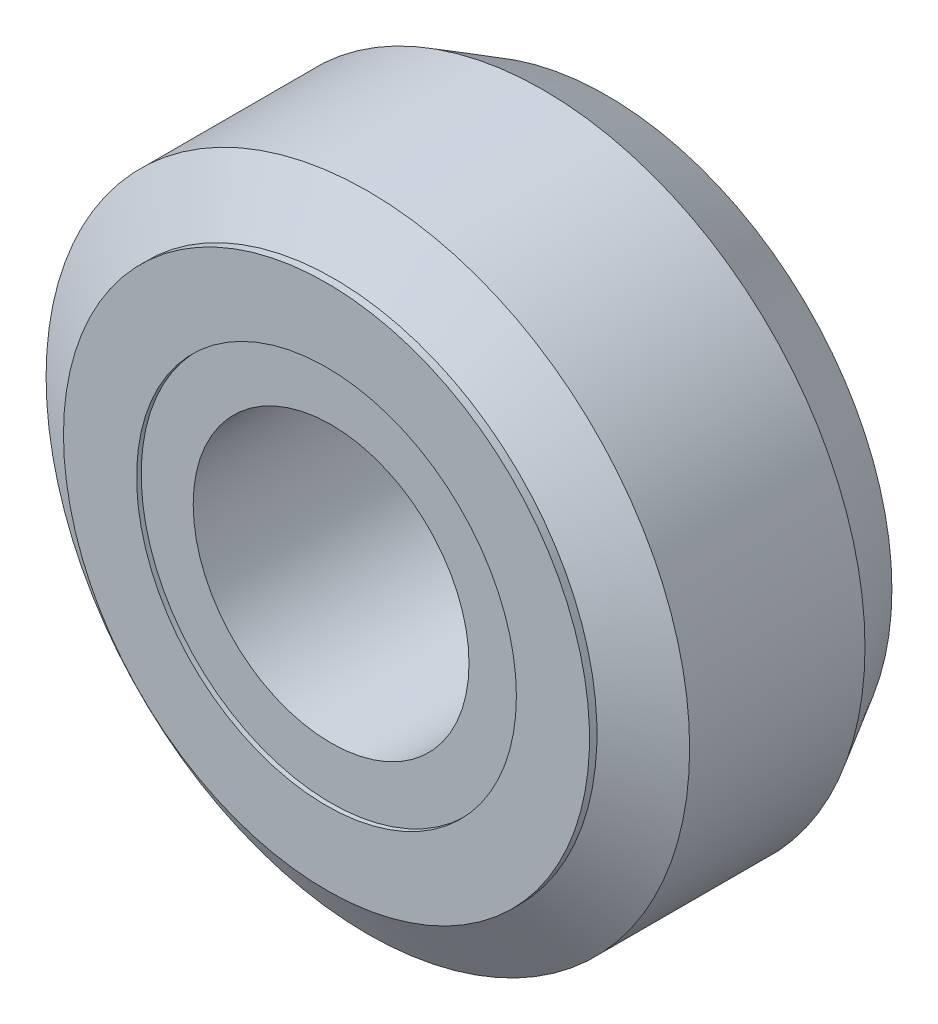
ISO-10303-21;
HEADER;
FILE_DESCRIPTION(('STEP AP214'),'2;1');
FILE_NAME('part.step','',(''),(''),'','','');
FILE_SCHEMA(('AUTOMOTIVE_DESIGN { 1 0 10303 214 1 1 1 1 }'));
ENDSEC;
DATA;
#1=APPLICATION_CONTEXT('core data for automotive mechanical design processes');
#2=APPLICATION_PROTOCOL_DEFINITION('international standard','automotive_design',2000,#1);
#3=PRODUCT_CONTEXT('',#1,'mechanical');
#4=PRODUCT('Part','Part','',(#3));
#5=PRODUCT_RELATED_PRODUCT_CATEGORY('part','',(#4));
#6=PRODUCT_DEFINITION_FORMATION('','',#4);
#7=PRODUCT_DEFINITION_CONTEXT('part definition',#1,'design');
#8=PRODUCT_DEFINITION('design','',#6,#7);
#9=PRODUCT_DEFINITION_SHAPE('','',#8);
#10=(LENGTH_UNIT() NAMED_UNIT(*) SI_UNIT(.MILLI.,.METRE.));
#11=(NAMED_UNIT(*) PLANE_ANGLE_UNIT() SI_UNIT($,.RADIAN.));
#12=(NAMED_UNIT(*) SI_UNIT($,.STERADIAN.) SOLID_ANGLE_UNIT());
#13=UNCERTAINTY_MEASURE_WITH_UNIT(LENGTH_MEASURE(1.E-05),#10,'distance_accuracy_value','');
#14=(GEOMETRIC_REPRESENTATION_CONTEXT(3) GLOBAL_UNCERTAINTY_ASSIGNED_CONTEXT((#13)) GLOBAL_UNIT_ASSIGNED_CONTEXT((#10,
#11,#12)) REPRESENTATION_CONTEXT('',''));
#15=CARTESIAN_POINT('',(0.,0.,0.));
#16=DIRECTION('',(0.,0.,1.));
#17=DIRECTION('',(1.,0.,0.));
#18=AXIS2_PLACEMENT_3D('',#15,#16,#17);
#19=CARTESIAN_POINT('',(0.,0.,1.5));
#20=DIRECTION('',(0.,0.,-1.));
#21=DIRECTION('',(-1.,0.,0.));
#22=AXIS2_PLACEMENT_3D('',#19,#20,#21);
#23=CONICAL_SURFACE('',#22,2.80717967697245,1.0471975511966);
#24=CARTESIAN_POINT('',(0.,0.,1.1));
#25=DIRECTION('',(0.,0.,1.));
#26=DIRECTION('',(1.,0.,0.));
#27=AXIS2_PLACEMENT_3D('',#24,#25,#26);
#28=CIRCLE('',#27,3.5);
#29=CARTESIAN_POINT('',(-3.5,0.,1.1));
#30=VERTEX_POINT('',#29);
#31=EDGE_CURVE('E53',#30,#30,#28,.F.);
#32=CARTESIAN_POINT('',(0.,0.,1.46896578970993));
#33=DIRECTION('',(0.,0.,-1.));
#34=DIRECTION('',(-1.,0.,0.));
#35=AXIS2_PLACEMENT_3D('',#32,#33,#34);
#36=CIRCLE('',#35,2.86093250596764);
#37=CARTESIAN_POINT('',(-2.86093250596764,0.,1.46896578970993));
#38=VERTEX_POINT('',#37);
#39=EDGE_CURVE('E63',#38,#38,#36,.T.);
#40=CARTESIAN_POINT('',(-3.5,0.,1.1));
#41=CARTESIAN_POINT('',(-3.49334304693716,0.,1.10384339364281));
#42=CARTESIAN_POINT('',(-3.48668609387433,0.,1.10768678728562));
#43=CARTESIAN_POINT('',(-3.47337218774865,0.,1.11537357457125));
#44=CARTESIAN_POINT('',(-3.46671523468581,0.,1.11921696821406));
#45=CARTESIAN_POINT('',(-3.45340132856014,0.,1.12690375549968));
#46=CARTESIAN_POINT('',(-3.4467443754973,0.,1.13074714914249));
#47=CARTESIAN_POINT('',(-3.43343046937163,0.,1.13843393642812));
#48=CARTESIAN_POINT('',(-3.42677351630879,0.,1.14227733007093));
#49=CARTESIAN_POINT('',(-3.41345961018312,0.,1.14996411735655));
#50=CARTESIAN_POINT('',(-3.40680265712028,0.,1.15380751099936));
#51=CARTESIAN_POINT('',(-3.39348875099461,0.,1.16149429828499));
#52=CARTESIAN_POINT('',(-3.38683179793177,0.,1.1653376919278));
#53=CARTESIAN_POINT('',(-3.37351789180609,0.,1.17302447921342));
#54=CARTESIAN_POINT('',(-3.36686093874326,0.,1.17686787285623));
#55=CARTESIAN_POINT('',(-3.35354703261758,0.,1.18455466014186));
#56=CARTESIAN_POINT('',(-3.34689007955475,0.,1.18839805378467));
#57=CARTESIAN_POINT('',(-3.33357617342907,0.,1.19608484107029));
#58=CARTESIAN_POINT('',(-3.32691922036624,0.,1.19992823471311));
#59=CARTESIAN_POINT('',(-3.31360531424056,0.,1.20761502199873));
#60=CARTESIAN_POINT('',(-3.30694836117772,0.,1.21145841564154));
#61=CARTESIAN_POINT('',(-3.29363445505205,0.,1.21914520292716));
#62=CARTESIAN_POINT('',(-3.28697750198921,0.,1.22298859656998));
#63=CARTESIAN_POINT('',(-3.27366359586354,0.,1.2306753838556));
#64=CARTESIAN_POINT('',(-3.2670066428007,0.,1.23451877749841));
#65=CARTESIAN_POINT('',(-3.25369273667503,0.,1.24220556478403));
#66=CARTESIAN_POINT('',(-3.24703578361219,0.,1.24604895842685));
#67=CARTESIAN_POINT('',(-3.23372187748652,0.,1.25373574571247));
#68=CARTESIAN_POINT('',(-3.22706492442368,0.,1.25757913935528));
#69=CARTESIAN_POINT('',(-3.213751018298,0.,1.2652659266409));
#70=CARTESIAN_POINT('',(-3.20709406523517,0.,1.26910932028372));
#71=CARTESIAN_POINT('',(-3.19378015910949,0.,1.27679610756934));
#72=CARTESIAN_POINT('',(-3.18712320604666,0.,1.28063950121215));
#73=CARTESIAN_POINT('',(-3.17380929992098,0.,1.28832628849777));
#74=CARTESIAN_POINT('',(-3.16715234685814,0.,1.29216968214059));
#75=CARTESIAN_POINT('',(-3.15383844073247,0.,1.29985646942621));
#76=CARTESIAN_POINT('',(-3.14718148766963,0.,1.30369986306902));
#77=CARTESIAN_POINT('',(-3.13386758154396,0.,1.31138665035465));
#78=CARTESIAN_POINT('',(-3.12721062848112,0.,1.31523004399746));
#79=CARTESIAN_POINT('',(-3.11389672235545,0.,1.32291683128308));
#80=CARTESIAN_POINT('',(-3.10723976929261,0.,1.32676022492589));
#81=CARTESIAN_POINT('',(-3.09392586316694,0.,1.33444701221152));
#82=CARTESIAN_POINT('',(-3.0872689101041,0.,1.33829040585433));
#83=CARTESIAN_POINT('',(-3.07395500397842,0.,1.34597719313995));
#84=CARTESIAN_POINT('',(-3.06729805091559,0.,1.34982058678276));
#85=CARTESIAN_POINT('',(-3.05398414478991,0.,1.35750737406839));
#86=CARTESIAN_POINT('',(-3.04732719172708,0.,1.3613507677112));
#87=CARTESIAN_POINT('',(-3.0340132856014,0.,1.36903755499682));
#88=CARTESIAN_POINT('',(-3.02735633253856,0.,1.37288094863963));
#89=CARTESIAN_POINT('',(-3.01404242641289,0.,1.38056773592526));
#90=CARTESIAN_POINT('',(-3.00738547335005,0.,1.38441112956807));
#91=CARTESIAN_POINT('',(-2.99407156722438,0.,1.39209791685369));
#92=CARTESIAN_POINT('',(-2.98741461416154,0.,1.3959413104965));
#93=CARTESIAN_POINT('',(-2.97410070803587,0.,1.40362809778213));
#94=CARTESIAN_POINT('',(-2.96744375497303,0.,1.40747149142494));
#95=CARTESIAN_POINT('',(-2.95412984884736,0.,1.41515827871056));
#96=CARTESIAN_POINT('',(-2.94747289578452,0.,1.41900167235337));
#97=CARTESIAN_POINT('',(-2.93415898965884,0.,1.426688459639));
#98=CARTESIAN_POINT('',(-2.92750203659601,0.,1.43053185328181));
#99=CARTESIAN_POINT('',(-2.91418813047033,0.,1.43821864056743));
#100=CARTESIAN_POINT('',(-2.9075311774075,0.,1.44206203421024));
#101=CARTESIAN_POINT('',(-2.89421727128182,0.,1.44974882149587));
#102=CARTESIAN_POINT('',(-2.88756031821899,0.,1.45359221513868));
#103=CARTESIAN_POINT('',(-2.87424641209331,0.,1.4612790024243));
#104=CARTESIAN_POINT('',(-2.86758945903047,0.,1.46512239606711));
#105=CARTESIAN_POINT('',(-2.86093250596764,0.,1.46896578970993));
#106=B_SPLINE_CURVE_WITH_KNOTS('',3,(#40,#41,#42,#43,#44,#45,#46,#47,#48,#49,#50,#51,#52,#53,
#54,#55,#56,#57,#58,#59,#60,#61,#62,#63,#64,#65,#66,#67,#68,#69,#70,#71,#72,#73,#74,#75,#76,#77,
#78,#79,#80,#81,#82,#83,#84,#85,#86,#87,#88,#89,#90,#91,#92,#93,#94,#95,#96,#97,#98,#99,#100,
#101,#102,#103,#104,#105),.UNSPECIFIED.,.F.,.F.,(4,2,2,2,2,2,2,2,2,2,2,2,2,2,2,2,2,2,2,2,2,2,2,
2,2,2,2,2,2,2,2,2,4),(0.,0.0230603618568704,0.0461207237137406,0.0691810855706109,
0.0922414474274813,0.115301809284352,0.138362171141222,0.161422532998092,0.184482894854962,
0.207543256711833,0.230603618568703,0.253663980425573,0.276724342282444,0.299784704139314,
0.322845065996184,0.345905427853055,0.368965789709925,0.392026151566795,0.415086513423665,
0.438146875280536,0.461207237137406,0.484267598994277,0.507327960851147,0.530388322708017,
0.553448684564887,0.576509046421758,0.599569408278628,0.622629770135498,0.645690131992368,
0.668750493849239,0.691810855706109,0.714871217562979,0.73793157941985),.UNSPECIFIED.);
#107=EDGE_CURVE('BSEAM33',#30,#38,#106,.T.);
#108=ORIENTED_EDGE('',*,*,#31,.F.);
#109=ORIENTED_EDGE('',*,*,#39,.T.);
#110=ORIENTED_EDGE('',*,*,#107,.T.);
#111=ORIENTED_EDGE('',*,*,#107,.F.);
#112=EDGE_LOOP('',(#108,#110,#109,#111));
#113=FACE_BOUND('',#112,.T.);
#114=ADVANCED_FACE('F33',(#113),#23,.T.);
#115=CARTESIAN_POINT('',(0.,0.,-1.5));
#116=DIRECTION('',(0.,0.,1.));
#117=DIRECTION('',(1.,0.,0.));
#118=AXIS2_PLACEMENT_3D('',#115,#116,#117);
#119=PLANE('',#118);
#120=CARTESIAN_POINT('',(0.,0.,-1.5));
#121=DIRECTION('',(0.,0.,1.));
#122=DIRECTION('',(1.,0.,0.));
#123=AXIS2_PLACEMENT_3D('',#120,#121,#122);
#124=CIRCLE('',#123,2.86093250596764);
#125=CARTESIAN_POINT('',(2.86093250596764,0.,-1.5));
#126=VERTEX_POINT('',#125);
#127=EDGE_CURVE('E41',#126,#126,#124,.F.);
#128=ORIENTED_EDGE('',*,*,#127,.F.);
#129=EDGE_LOOP('',(#128));
#130=FACE_BOUND('',#129,.T.);
#131=CARTESIAN_POINT('',(0.,0.,-1.5));
#132=DIRECTION('',(0.,0.,1.));
#133=DIRECTION('',(1.,0.,0.));
#134=AXIS2_PLACEMENT_3D('',#131,#132,#133);
#135=CIRCLE('',#134,3.1);
#136=CARTESIAN_POINT('',(3.1,0.,-1.5));
#137=VERTEX_POINT('',#136);
#138=EDGE_CURVE('E46',#137,#137,#135,.F.);
#139=ORIENTED_EDGE('',*,*,#138,.T.);
#140=EDGE_LOOP('',(#139));
#141=FACE_BOUND('',#140,.T.);
#142=ADVANCED_FACE('F99',(#130,#141),#119,.F.);
#143=CARTESIAN_POINT('',(0.,0.,1.5));
#144=DIRECTION('',(0.,0.,-1.));
#145=DIRECTION('',(-1.,0.,0.));
#146=AXIS2_PLACEMENT_3D('',#143,#144,#145);
#147=CYLINDRICAL_SURFACE('',#146,3.5);
#148=CARTESIAN_POINT('',(0.,0.,-0.807179676972451));
#149=DIRECTION('',(0.,0.,1.));
#150=DIRECTION('',(1.,0.,0.));
#151=AXIS2_PLACEMENT_3D('',#148,#149,#150);
#152=CIRCLE('',#151,3.5);
#153=CARTESIAN_POINT('',(3.5,0.,-0.807179676972451));
#154=VERTEX_POINT('',#153);
#155=EDGE_CURVE('E59',#154,#154,#152,.T.);
#156=ORIENTED_EDGE('',*,*,#155,.T.);
#157=EDGE_LOOP('',(#156));
#158=FACE_BOUND('',#157,.T.);
#159=ORIENTED_EDGE('',*,*,#31,.T.);
#160=EDGE_LOOP('',(#159));
#161=FACE_BOUND('',#160,.T.);
#162=ADVANCED_FACE('F104',(#158,#161),#147,.T.);
#163=CARTESIAN_POINT('',(0.,0.,-0.807179676972451));
#164=DIRECTION('',(0.,0.,1.));
#165=DIRECTION('',(1.,0.,0.));
#166=AXIS2_PLACEMENT_3D('',#163,#164,#165);
#167=CONICAL_SURFACE('',#166,3.5,0.523598775598299);
#168=ORIENTED_EDGE('',*,*,#138,.F.);
#169=EDGE_LOOP('',(#168));
#170=FACE_BOUND('',#169,.T.);
#171=ORIENTED_EDGE('',*,*,#155,.F.);
#172=EDGE_LOOP('',(#171));
#173=FACE_BOUND('',#172,.T.);
#174=ADVANCED_FACE('F111',(#170,#173),#167,.T.);
#175=CARTESIAN_POINT('',(0.,0.,-1.55));
#176=DIRECTION('',(0.,0.,1.));
#177=DIRECTION('',(1.,0.,0.));
#178=AXIS2_PLACEMENT_3D('',#175,#176,#177);
#179=CYLINDRICAL_SURFACE('',#178,2.06554146878285);
#180=CARTESIAN_POINT('',(0.,0.,1.5));
#181=DIRECTION('',(0.,0.,1.));
#182=DIRECTION('',(1.,0.,0.));
#183=AXIS2_PLACEMENT_3D('',#180,#181,#182);
#184=CIRCLE('',#183,2.06554146878285);
#185=CARTESIAN_POINT('',(2.06554146878285,0.,1.5));
#186=VERTEX_POINT('',#185);
#187=EDGE_CURVE('E10',#186,#186,#184,.F.);
#188=CARTESIAN_POINT('',(0.,0.,1.55));
#189=DIRECTION('',(0.,0.,-1.));
#190=DIRECTION('',(-1.,0.,0.));
#191=AXIS2_PLACEMENT_3D('',#188,#189,#190);
#192=CIRCLE('',#191,2.06554146878285);
#193=CARTESIAN_POINT('',(2.06554146878285,0.,1.55));
#194=VERTEX_POINT('',#193);
#195=EDGE_CURVE('E77',#194,#194,#192,.T.);
#196=CARTESIAN_POINT('',(2.06554146878285,0.,1.5));
#197=CARTESIAN_POINT('',(2.06554146878285,0.,1.50052083333333));
#198=CARTESIAN_POINT('',(2.06554146878285,0.,1.50104166666667));
#199=CARTESIAN_POINT('',(2.06554146878285,0.,1.50208333333333));
#200=CARTESIAN_POINT('',(2.06554146878285,0.,1.50260416666667));
#201=CARTESIAN_POINT('',(2.06554146878285,0.,1.50364583333333));
#202=CARTESIAN_POINT('',(2.06554146878285,0.,1.50416666666667));
#203=CARTESIAN_POINT('',(2.06554146878285,0.,1.50520833333333));
#204=CARTESIAN_POINT('',(2.06554146878285,0.,1.50572916666667));
#205=CARTESIAN_POINT('',(2.06554146878285,0.,1.50677083333333));
#206=CARTESIAN_POINT('',(2.06554146878285,0.,1.50729166666667));
#207=CARTESIAN_POINT('',(2.06554146878285,0.,1.50833333333333));
#208=CARTESIAN_POINT('',(2.06554146878285,0.,1.50885416666667));
#209=CARTESIAN_POINT('',(2.06554146878285,0.,1.50989583333333));
#210=CARTESIAN_POINT('',(2.06554146878285,0.,1.51041666666667));
#211=CARTESIAN_POINT('',(2.06554146878285,0.,1.51145833333333));
#212=CARTESIAN_POINT('',(2.06554146878285,0.,1.51197916666667));
#213=CARTESIAN_POINT('',(2.06554146878285,0.,1.51302083333333));
#214=CARTESIAN_POINT('',(2.06554146878285,0.,1.51354166666667));
#215=CARTESIAN_POINT('',(2.06554146878285,0.,1.51458333333333));
#216=CARTESIAN_POINT('',(2.06554146878285,0.,1.51510416666667));
#217=CARTESIAN_POINT('',(2.06554146878285,0.,1.51614583333333));
#218=CARTESIAN_POINT('',(2.06554146878285,0.,1.51666666666667));
#219=CARTESIAN_POINT('',(2.06554146878285,0.,1.51770833333333));
#220=CARTESIAN_POINT('',(2.06554146878285,0.,1.51822916666667));
#221=CARTESIAN_POINT('',(2.06554146878285,0.,1.51927083333333));
#222=CARTESIAN_POINT('',(2.06554146878285,0.,1.51979166666667));
#223=CARTESIAN_POINT('',(2.06554146878285,0.,1.52083333333333));
#224=CARTESIAN_POINT('',(2.06554146878285,0.,1.52135416666667));
#225=CARTESIAN_POINT('',(2.06554146878285,0.,1.52239583333333));
#226=CARTESIAN_POINT('',(2.06554146878285,0.,1.52291666666667));
#227=CARTESIAN_POINT('',(2.06554146878285,0.,1.52395833333333));
#228=CARTESIAN_POINT('',(2.06554146878285,0.,1.52447916666667));
#229=CARTESIAN_POINT('',(2.06554146878285,0.,1.52552083333333));
#230=CARTESIAN_POINT('',(2.06554146878285,0.,1.52604166666667));
#231=CARTESIAN_POINT('',(2.06554146878285,0.,1.52708333333333));
#232=CARTESIAN_POINT('',(2.06554146878285,0.,1.52760416666667));
#233=CARTESIAN_POINT('',(2.06554146878285,0.,1.52864583333333));
#234=CARTESIAN_POINT('',(2.06554146878285,0.,1.52916666666667));
#235=CARTESIAN_POINT('',(2.06554146878285,0.,1.53020833333333));
#236=CARTESIAN_POINT('',(2.06554146878285,0.,1.53072916666667));
#237=CARTESIAN_POINT('',(2.06554146878285,0.,1.53177083333333));
#238=CARTESIAN_POINT('',(2.06554146878285,0.,1.53229166666667));
#239=CARTESIAN_POINT('',(2.06554146878285,0.,1.53333333333333));
#240=CARTESIAN_POINT('',(2.06554146878285,0.,1.53385416666667));
#241=CARTESIAN_POINT('',(2.06554146878285,0.,1.53489583333333));
#242=CARTESIAN_POINT('',(2.06554146878285,0.,1.53541666666667));
#243=CARTESIAN_POINT('',(2.06554146878285,0.,1.53645833333333));
#244=CARTESIAN_POINT('',(2.06554146878285,0.,1.53697916666667));
#245=CARTESIAN_POINT('',(2.06554146878285,0.,1.53802083333333));
#246=CARTESIAN_POINT('',(2.06554146878285,0.,1.53854166666667));
#247=CARTESIAN_POINT('',(2.06554146878285,0.,1.53958333333333));
#248=CARTESIAN_POINT('',(2.06554146878285,0.,1.54010416666667));
#249=CARTESIAN_POINT('',(2.06554146878285,0.,1.54114583333333));
#250=CARTESIAN_POINT('',(2.06554146878285,0.,1.54166666666667));
#251=CARTESIAN_POINT('',(2.06554146878285,0.,1.54270833333333));
#252=CARTESIAN_POINT('',(2.06554146878285,0.,1.54322916666667));
#253=CARTESIAN_POINT('',(2.06554146878285,0.,1.54427083333333));
#254=CARTESIAN_POINT('',(2.06554146878285,0.,1.54479166666667));
#255=CARTESIAN_POINT('',(2.06554146878285,0.,1.54583333333333));
#256=CARTESIAN_POINT('',(2.06554146878285,0.,1.54635416666667));
#257=CARTESIAN_POINT('',(2.06554146878285,0.,1.54739583333333));
#258=CARTESIAN_POINT('',(2.06554146878285,0.,1.54791666666667));
#259=CARTESIAN_POINT('',(2.06554146878285,0.,1.54895833333333));
#260=CARTESIAN_POINT('',(2.06554146878285,0.,1.54947916666667));
#261=CARTESIAN_POINT('',(2.06554146878285,0.,1.55));
#262=B_SPLINE_CURVE_WITH_KNOTS('',3,(#196,#197,#198,#199,#200,#201,#202,#203,#204,#205,#206,
#207,#208,#209,#210,#211,#212,#213,#214,#215,#216,#217,#218,#219,#220,#221,#222,#223,#224,#225,
#226,#227,#228,#229,#230,#231,#232,#233,#234,#235,#236,#237,#238,#239,#240,#241,#242,#243,#244,
#245,#246,#247,#248,#249,#250,#251,#252,#253,#254,#255,#256,#257,#258,#259,#260,#261),
.UNSPECIFIED.,.F.,.F.,(4,2,2,2,2,2,2,2,2,2,2,2,2,2,2,2,2,2,2,2,2,2,2,2,2,2,2,2,2,2,2,2,4),(0.,
0.00156249999999983,0.00312500000000009,0.00468749999999992,0.00625000000000018,
0.00781250000000001,0.00937500000000027,0.0109375000000001,0.0125000000000004,
0.0140625000000002,0.015625,0.0171875000000003,0.0187500000000001,0.0203125000000004,
0.0218750000000002,0.0234375000000005,0.0250000000000003,0.0265625000000001,0.0281250000000004,
0.0296875000000002,0.0312500000000005,0.0328125000000003,0.0343750000000006,0.0359375000000004,
0.0375000000000002,0.0390625000000005,0.0406250000000003,0.0421875000000006,0.0437500000000004,
0.0453125000000006,0.0468750000000005,0.0484375000000007,0.0500000000000006),.UNSPECIFIED.);
#263=EDGE_CURVE('BSEAM117',#186,#194,#262,.T.);
#264=ORIENTED_EDGE('',*,*,#187,.T.);
#265=ORIENTED_EDGE('',*,*,#195,.F.);
#266=ORIENTED_EDGE('',*,*,#263,.T.);
#267=ORIENTED_EDGE('',*,*,#263,.F.);
#268=EDGE_LOOP('',(#264,#266,#265,#267));
#269=FACE_BOUND('',#268,.T.);
#270=ADVANCED_FACE('F117',(#269),#179,.F.);
#271=CARTESIAN_POINT('',(0.,0.,1.55));
#272=DIRECTION('',(0.,0.,-1.));
#273=DIRECTION('',(-1.,0.,0.));
#274=AXIS2_PLACEMENT_3D('',#271,#272,#273);
#275=PLANE('',#274);
#276=CARTESIAN_POINT('',(0.,0.,1.55));
#277=DIRECTION('',(0.,0.,-1.));
#278=DIRECTION('',(-1.,0.,0.));
#279=AXIS2_PLACEMENT_3D('',#276,#277,#278);
#280=CIRCLE('',#279,2.86093250596764);
#281=CARTESIAN_POINT('',(-2.86093250596764,0.,1.55));
#282=VERTEX_POINT('',#281);
#283=EDGE_CURVE('E70',#282,#282,#280,.T.);
#284=ORIENTED_EDGE('',*,*,#283,.F.);
#285=EDGE_LOOP('',(#284));
#286=FACE_BOUND('',#285,.T.);
#287=ORIENTED_EDGE('',*,*,#195,.T.);
#288=EDGE_LOOP('',(#287));
#289=FACE_BOUND('',#288,.T.);
#290=ADVANCED_FACE('F133',(#286,#289),#275,.F.);
#291=CARTESIAN_POINT('',(0.,0.,-1.55));
#292=DIRECTION('',(0.,0.,1.));
#293=DIRECTION('',(1.,0.,0.));
#294=AXIS2_PLACEMENT_3D('',#291,#292,#293);
#295=CYLINDRICAL_SURFACE('',#294,2.86093250596764);
#296=ORIENTED_EDGE('',*,*,#39,.F.);
#297=EDGE_LOOP('',(#296));
#298=FACE_BOUND('',#297,.T.);
#299=ORIENTED_EDGE('',*,*,#283,.T.);
#300=EDGE_LOOP('',(#299));
#301=FACE_BOUND('',#300,.T.);
#302=ADVANCED_FACE('F95',(#298,#301),#295,.T.);
#303=CARTESIAN_POINT('',(0.,0.,1.5));
#304=DIRECTION('',(0.,0.,1.));
#305=DIRECTION('',(1.,0.,0.));
#306=AXIS2_PLACEMENT_3D('',#303,#304,#305);
#307=PLANE('',#306);
#308=CARTESIAN_POINT('',(0.,0.,1.5));
#309=DIRECTION('',(0.,0.,1.));
#310=DIRECTION('',(1.,0.,0.));
#311=AXIS2_PLACEMENT_3D('',#308,#309,#310);
#312=CIRCLE('',#311,1.5);
#313=CARTESIAN_POINT('',(1.5,0.,1.5));
#314=VERTEX_POINT('',#313);
#315=EDGE_CURVE('E50',#314,#314,#312,.T.);
#316=ORIENTED_EDGE('',*,*,#315,.F.);
#317=EDGE_LOOP('',(#316));
#318=FACE_BOUND('',#317,.T.);
#319=ORIENTED_EDGE('',*,*,#187,.F.);
#320=EDGE_LOOP('',(#319));
#321=FACE_BOUND('',#320,.T.);
#322=ADVANCED_FACE('F125',(#318,#321),#307,.T.);
#323=CARTESIAN_POINT('',(0.,0.,1.5));
#324=DIRECTION('',(0.,0.,-1.));
#325=DIRECTION('',(-1.,0.,0.));
#326=AXIS2_PLACEMENT_3D('',#323,#324,#325);
#327=CYLINDRICAL_SURFACE('',#326,1.5);
#328=ORIENTED_EDGE('',*,*,#315,.T.);
#329=EDGE_LOOP('',(#328));
#330=FACE_BOUND('',#329,.T.);
#331=CARTESIAN_POINT('',(0.,0.,-1.5));
#332=DIRECTION('',(0.,0.,1.));
#333=DIRECTION('',(1.,0.,0.));
#334=AXIS2_PLACEMENT_3D('',#331,#332,#333);
#335=CIRCLE('',#334,1.5);
#336=CARTESIAN_POINT('',(1.5,0.,-1.5));
#337=VERTEX_POINT('',#336);
#338=EDGE_CURVE('E54',#337,#337,#335,.T.);
#339=ORIENTED_EDGE('',*,*,#338,.F.);
#340=EDGE_LOOP('',(#339));
#341=FACE_BOUND('',#340,.T.);
#342=ADVANCED_FACE('F128',(#330,#341),#327,.F.);
#343=ORIENTED_EDGE('',*,*,#338,.T.);
#344=EDGE_LOOP('',(#343));
#345=FACE_BOUND('',#344,.T.);
#346=CARTESIAN_POINT('',(0.,0.,-1.5));
#347=DIRECTION('',(0.,0.,1.));
#348=DIRECTION('',(1.,0.,0.));
#349=AXIS2_PLACEMENT_3D('',#346,#347,#348);
#350=CIRCLE('',#349,2.06554146878285);
#351=CARTESIAN_POINT('',(2.06554146878285,0.,-1.5));
#352=VERTEX_POINT('',#351);
#353=EDGE_CURVE('E37',#352,#352,#350,.F.);
#354=ORIENTED_EDGE('',*,*,#353,.T.);
#355=EDGE_LOOP('',(#354));
#356=FACE_BOUND('',#355,.T.);
#357=ADVANCED_FACE('F107',(#345,#356),#119,.F.);
#358=CARTESIAN_POINT('',(0.,0.,-1.55));
#359=DIRECTION('',(0.,0.,-1.));
#360=DIRECTION('',(-1.,0.,0.));
#361=AXIS2_PLACEMENT_3D('',#358,#359,#360);
#362=CIRCLE('',#361,2.06554146878285);
#363=CARTESIAN_POINT('',(2.06554146878285,0.,-1.55));
#364=VERTEX_POINT('',#363);
#365=EDGE_CURVE('E75',#364,#364,#362,.T.);
#366=CARTESIAN_POINT('',(2.06554146878285,0.,-1.55));
#367=CARTESIAN_POINT('',(2.06554146878285,0.,-1.54947916666667));
#368=CARTESIAN_POINT('',(2.06554146878285,0.,-1.54895833333333));
#369=CARTESIAN_POINT('',(2.06554146878285,0.,-1.54791666666667));
#370=CARTESIAN_POINT('',(2.06554146878285,0.,-1.54739583333333));
#371=CARTESIAN_POINT('',(2.06554146878285,0.,-1.54635416666667));
#372=CARTESIAN_POINT('',(2.06554146878285,0.,-1.54583333333333));
#373=CARTESIAN_POINT('',(2.06554146878285,0.,-1.54479166666667));
#374=CARTESIAN_POINT('',(2.06554146878285,0.,-1.54427083333333));
#375=CARTESIAN_POINT('',(2.06554146878285,0.,-1.54322916666667));
#376=CARTESIAN_POINT('',(2.06554146878285,0.,-1.54270833333333));
#377=CARTESIAN_POINT('',(2.06554146878285,0.,-1.54166666666667));
#378=CARTESIAN_POINT('',(2.06554146878285,0.,-1.54114583333333));
#379=CARTESIAN_POINT('',(2.06554146878285,0.,-1.54010416666667));
#380=CARTESIAN_POINT('',(2.06554146878285,0.,-1.53958333333333));
#381=CARTESIAN_POINT('',(2.06554146878285,0.,-1.53854166666667));
#382=CARTESIAN_POINT('',(2.06554146878285,0.,-1.53802083333333));
#383=CARTESIAN_POINT('',(2.06554146878285,0.,-1.53697916666667));
#384=CARTESIAN_POINT('',(2.06554146878285,0.,-1.53645833333333));
#385=CARTESIAN_POINT('',(2.06554146878285,0.,-1.53541666666667));
#386=CARTESIAN_POINT('',(2.06554146878285,0.,-1.53489583333333));
#387=CARTESIAN_POINT('',(2.06554146878285,0.,-1.53385416666667));
#388=CARTESIAN_POINT('',(2.06554146878285,0.,-1.53333333333333));
#389=CARTESIAN_POINT('',(2.06554146878285,0.,-1.53229166666667));
#390=CARTESIAN_POINT('',(2.06554146878285,0.,-1.53177083333333));
#391=CARTESIAN_POINT('',(2.06554146878285,0.,-1.53072916666667));
#392=CARTESIAN_POINT('',(2.06554146878285,0.,-1.53020833333333));
#393=CARTESIAN_POINT('',(2.06554146878285,0.,-1.52916666666667));
#394=CARTESIAN_POINT('',(2.06554146878285,0.,-1.52864583333333));
#395=CARTESIAN_POINT('',(2.06554146878285,0.,-1.52760416666667));
#396=CARTESIAN_POINT('',(2.06554146878285,0.,-1.52708333333333));
#397=CARTESIAN_POINT('',(2.06554146878285,0.,-1.52604166666667));
#398=CARTESIAN_POINT('',(2.06554146878285,0.,-1.52552083333333));
#399=CARTESIAN_POINT('',(2.06554146878285,0.,-1.52447916666667));
#400=CARTESIAN_POINT('',(2.06554146878285,0.,-1.52395833333333));
#401=CARTESIAN_POINT('',(2.06554146878285,0.,-1.52291666666667));
#402=CARTESIAN_POINT('',(2.06554146878285,0.,-1.52239583333333));
#403=CARTESIAN_POINT('',(2.06554146878285,0.,-1.52135416666667));
#404=CARTESIAN_POINT('',(2.06554146878285,0.,-1.52083333333333));
#405=CARTESIAN_POINT('',(2.06554146878285,0.,-1.51979166666667));
#406=CARTESIAN_POINT('',(2.06554146878285,0.,-1.51927083333333));
#407=CARTESIAN_POINT('',(2.06554146878285,0.,-1.51822916666667));
#408=CARTESIAN_POINT('',(2.06554146878285,0.,-1.51770833333333));
#409=CARTESIAN_POINT('',(2.06554146878285,0.,-1.51666666666667));
#410=CARTESIAN_POINT('',(2.06554146878285,0.,-1.51614583333333));
#411=CARTESIAN_POINT('',(2.06554146878285,0.,-1.51510416666667));
#412=CARTESIAN_POINT('',(2.06554146878285,0.,-1.51458333333333));
#413=CARTESIAN_POINT('',(2.06554146878285,0.,-1.51354166666667));
#414=CARTESIAN_POINT('',(2.06554146878285,0.,-1.51302083333333));
#415=CARTESIAN_POINT('',(2.06554146878285,0.,-1.51197916666667));
#416=CARTESIAN_POINT('',(2.06554146878285,0.,-1.51145833333333));
#417=CARTESIAN_POINT('',(2.06554146878285,0.,-1.51041666666667));
#418=CARTESIAN_POINT('',(2.06554146878285,0.,-1.50989583333333));
#419=CARTESIAN_POINT('',(2.06554146878285,0.,-1.50885416666667));
#420=CARTESIAN_POINT('',(2.06554146878285,0.,-1.50833333333333));
#421=CARTESIAN_POINT('',(2.06554146878285,0.,-1.50729166666667));
#422=CARTESIAN_POINT('',(2.06554146878285,0.,-1.50677083333333));
#423=CARTESIAN_POINT('',(2.06554146878285,0.,-1.50572916666667));
#424=CARTESIAN_POINT('',(2.06554146878285,0.,-1.50520833333333));
#425=CARTESIAN_POINT('',(2.06554146878285,0.,-1.50416666666667));
#426=CARTESIAN_POINT('',(2.06554146878285,0.,-1.50364583333333));
#427=CARTESIAN_POINT('',(2.06554146878285,0.,-1.50260416666667));
#428=CARTESIAN_POINT('',(2.06554146878285,0.,-1.50208333333333));
#429=CARTESIAN_POINT('',(2.06554146878285,0.,-1.50104166666667));
#430=CARTESIAN_POINT('',(2.06554146878285,0.,-1.50052083333333));
#431=CARTESIAN_POINT('',(2.06554146878285,0.,-1.5));
#432=B_SPLINE_CURVE_WITH_KNOTS('',3,(#366,#367,#368,#369,#370,#371,#372,#373,#374,#375,#376,
#377,#378,#379,#380,#381,#382,#383,#384,#385,#386,#387,#388,#389,#390,#391,#392,#393,#394,#395,
#396,#397,#398,#399,#400,#401,#402,#403,#404,#405,#406,#407,#408,#409,#410,#411,#412,#413,#414,
#415,#416,#417,#418,#419,#420,#421,#422,#423,#424,#425,#426,#427,#428,#429,#430,#431),
.UNSPECIFIED.,.F.,.F.,(4,2,2,2,2,2,2,2,2,2,2,2,2,2,2,2,2,2,2,2,2,2,2,2,2,2,2,2,2,2,2,2,4),(0.,
0.00156250000000004,0.00312500000000009,0.00468750000000013,0.00624999999999996,
0.00781250000000001,0.00937500000000005,0.0109375000000001,0.0124999999999999,0.0140625,
0.015625,0.0171875000000001,0.0187499999999999,0.0203124999999999,0.021875,0.0234375,
0.0249999999999998,0.0265624999999999,0.0281249999999999,0.0296875,0.0312499999999998,
0.0328124999999999,0.0343749999999999,0.0359374999999999,0.0374999999999998,0.0390624999999998,
0.0406249999999999,0.0421874999999999,0.0437499999999997,0.0453124999999998,0.0468749999999998,
0.0484374999999999,0.0499999999999997),.UNSPECIFIED.);
#433=EDGE_CURVE('BSEAM83',#364,#352,#432,.T.);
#434=ORIENTED_EDGE('',*,*,#365,.T.);
#435=ORIENTED_EDGE('',*,*,#353,.F.);
#436=ORIENTED_EDGE('',*,*,#433,.T.);
#437=ORIENTED_EDGE('',*,*,#433,.F.);
#438=EDGE_LOOP('',(#434,#436,#435,#437));
#439=FACE_BOUND('',#438,.T.);
#440=ADVANCED_FACE('F83',(#439),#179,.F.);
#441=CARTESIAN_POINT('',(0.,0.,-1.55));
#442=DIRECTION('',(0.,0.,-1.));
#443=DIRECTION('',(-1.,0.,0.));
#444=AXIS2_PLACEMENT_3D('',#441,#442,#443);
#445=CIRCLE('',#444,2.86093250596764);
#446=CARTESIAN_POINT('',(2.86093250596764,0.,-1.55));
#447=VERTEX_POINT('',#446);
#448=EDGE_CURVE('E65',#447,#447,#445,.T.);
#449=CARTESIAN_POINT('',(2.86093250596764,0.,-1.55));
#450=CARTESIAN_POINT('',(2.86093250596764,0.,-1.54947916666667));
#451=CARTESIAN_POINT('',(2.86093250596764,0.,-1.54895833333333));
#452=CARTESIAN_POINT('',(2.86093250596764,0.,-1.54791666666667));
#453=CARTESIAN_POINT('',(2.86093250596764,0.,-1.54739583333333));
#454=CARTESIAN_POINT('',(2.86093250596764,0.,-1.54635416666667));
#455=CARTESIAN_POINT('',(2.86093250596764,0.,-1.54583333333333));
#456=CARTESIAN_POINT('',(2.86093250596764,0.,-1.54479166666667));
#457=CARTESIAN_POINT('',(2.86093250596764,0.,-1.54427083333333));
#458=CARTESIAN_POINT('',(2.86093250596764,0.,-1.54322916666667));
#459=CARTESIAN_POINT('',(2.86093250596764,0.,-1.54270833333333));
#460=CARTESIAN_POINT('',(2.86093250596764,0.,-1.54166666666667));
#461=CARTESIAN_POINT('',(2.86093250596764,0.,-1.54114583333333));
#462=CARTESIAN_POINT('',(2.86093250596764,0.,-1.54010416666667));
#463=CARTESIAN_POINT('',(2.86093250596764,0.,-1.53958333333333));
#464=CARTESIAN_POINT('',(2.86093250596764,0.,-1.53854166666667));
#465=CARTESIAN_POINT('',(2.86093250596764,0.,-1.53802083333333));
#466=CARTESIAN_POINT('',(2.86093250596764,0.,-1.53697916666667));
#467=CARTESIAN_POINT('',(2.86093250596764,0.,-1.53645833333333));
#468=CARTESIAN_POINT('',(2.86093250596764,0.,-1.53541666666667));
#469=CARTESIAN_POINT('',(2.86093250596764,0.,-1.53489583333333));
#470=CARTESIAN_POINT('',(2.86093250596764,0.,-1.53385416666667));
#471=CARTESIAN_POINT('',(2.86093250596764,0.,-1.53333333333333));
#472=CARTESIAN_POINT('',(2.86093250596764,0.,-1.53229166666667));
#473=CARTESIAN_POINT('',(2.86093250596764,0.,-1.53177083333333));
#474=CARTESIAN_POINT('',(2.86093250596764,0.,-1.53072916666667));
#475=CARTESIAN_POINT('',(2.86093250596764,0.,-1.53020833333333));
#476=CARTESIAN_POINT('',(2.86093250596764,0.,-1.52916666666667));
#477=CARTESIAN_POINT('',(2.86093250596764,0.,-1.52864583333333));
#478=CARTESIAN_POINT('',(2.86093250596764,0.,-1.52760416666667));
#479=CARTESIAN_POINT('',(2.86093250596764,0.,-1.52708333333333));
#480=CARTESIAN_POINT('',(2.86093250596764,0.,-1.52604166666667));
#481=CARTESIAN_POINT('',(2.86093250596764,0.,-1.52552083333333));
#482=CARTESIAN_POINT('',(2.86093250596764,0.,-1.52447916666667));
#483=CARTESIAN_POINT('',(2.86093250596764,0.,-1.52395833333333));
#484=CARTESIAN_POINT('',(2.86093250596764,0.,-1.52291666666667));
#485=CARTESIAN_POINT('',(2.86093250596764,0.,-1.52239583333333));
#486=CARTESIAN_POINT('',(2.86093250596764,0.,-1.52135416666667));
#487=CARTESIAN_POINT('',(2.86093250596764,0.,-1.52083333333333));
#488=CARTESIAN_POINT('',(2.86093250596764,0.,-1.51979166666667));
#489=CARTESIAN_POINT('',(2.86093250596764,0.,-1.51927083333333));
#490=CARTESIAN_POINT('',(2.86093250596764,0.,-1.51822916666667));
#491=CARTESIAN_POINT('',(2.86093250596764,0.,-1.51770833333333));
#492=CARTESIAN_POINT('',(2.86093250596764,0.,-1.51666666666667));
#493=CARTESIAN_POINT('',(2.86093250596764,0.,-1.51614583333333));
#494=CARTESIAN_POINT('',(2.86093250596764,0.,-1.51510416666667));
#495=CARTESIAN_POINT('',(2.86093250596764,0.,-1.51458333333333));
#496=CARTESIAN_POINT('',(2.86093250596764,0.,-1.51354166666667));
#497=CARTESIAN_POINT('',(2.86093250596764,0.,-1.51302083333333));
#498=CARTESIAN_POINT('',(2.86093250596764,0.,-1.51197916666667));
#499=CARTESIAN_POINT('',(2.86093250596764,0.,-1.51145833333333));
#500=CARTESIAN_POINT('',(2.86093250596764,0.,-1.51041666666667));
#501=CARTESIAN_POINT('',(2.86093250596764,0.,-1.50989583333333));
#502=CARTESIAN_POINT('',(2.86093250596764,0.,-1.50885416666667));
#503=CARTESIAN_POINT('',(2.86093250596764,0.,-1.50833333333333));
#504=CARTESIAN_POINT('',(2.86093250596764,0.,-1.50729166666667));
#505=CARTESIAN_POINT('',(2.86093250596764,0.,-1.50677083333333));
#506=CARTESIAN_POINT('',(2.86093250596764,0.,-1.50572916666667));
#507=CARTESIAN_POINT('',(2.86093250596764,0.,-1.50520833333333));
#508=CARTESIAN_POINT('',(2.86093250596764,0.,-1.50416666666667));
#509=CARTESIAN_POINT('',(2.86093250596764,0.,-1.50364583333333));
#510=CARTESIAN_POINT('',(2.86093250596764,0.,-1.50260416666667));
#511=CARTESIAN_POINT('',(2.86093250596764,0.,-1.50208333333333));
#512=CARTESIAN_POINT('',(2.86093250596764,0.,-1.50104166666667));
#513=CARTESIAN_POINT('',(2.86093250596764,0.,-1.50052083333333));
#514=CARTESIAN_POINT('',(2.86093250596764,0.,-1.5));
#515=B_SPLINE_CURVE_WITH_KNOTS('',3,(#449,#450,#451,#452,#453,#454,#455,#456,#457,#458,#459,
#460,#461,#462,#463,#464,#465,#466,#467,#468,#469,#470,#471,#472,#473,#474,#475,#476,#477,#478,
#479,#480,#481,#482,#483,#484,#485,#486,#487,#488,#489,#490,#491,#492,#493,#494,#495,#496,#497,
#498,#499,#500,#501,#502,#503,#504,#505,#506,#507,#508,#509,#510,#511,#512,#513,#514),
.UNSPECIFIED.,.F.,.F.,(4,2,2,2,2,2,2,2,2,2,2,2,2,2,2,2,2,2,2,2,2,2,2,2,2,2,2,2,2,2,2,2,4),(0.,
0.00156249999999983,0.00312499999999987,0.00468749999999992,0.00624999999999975,
0.00781249999999979,0.00937499999999983,0.0109374999999999,0.0124999999999997,
0.0140624999999998,0.0156249999999998,0.0171874999999998,0.0187499999999997,0.0203124999999997,
0.0218749999999998,0.0234374999999998,0.0249999999999996,0.0265624999999997,0.0281249999999997,
0.0296874999999998,0.0312499999999996,0.0328124999999996,0.0343749999999997,0.0359374999999997,
0.0374999999999996,0.0390624999999996,0.0406249999999996,0.0421874999999997,0.0437499999999995,
0.0453124999999996,0.0468749999999996,0.0484374999999997,0.0499999999999995),.UNSPECIFIED.);
#516=EDGE_CURVE('BSEAM88',#447,#126,#515,.T.);
#517=ORIENTED_EDGE('',*,*,#448,.F.);
#518=ORIENTED_EDGE('',*,*,#127,.T.);
#519=ORIENTED_EDGE('',*,*,#516,.T.);
#520=ORIENTED_EDGE('',*,*,#516,.F.);
#521=EDGE_LOOP('',(#517,#519,#518,#520));
#522=FACE_BOUND('',#521,.T.);
#523=ADVANCED_FACE('F88',(#522),#295,.T.);
#524=CARTESIAN_POINT('',(0.,0.,-1.55));
#525=DIRECTION('',(0.,0.,-1.));
#526=DIRECTION('',(-1.,0.,0.));
#527=AXIS2_PLACEMENT_3D('',#524,#525,#526);
#528=PLANE('',#527);
#529=ORIENTED_EDGE('',*,*,#448,.T.);
#530=EDGE_LOOP('',(#529));
#531=FACE_BOUND('',#530,.T.);
#532=ORIENTED_EDGE('',*,*,#365,.F.);
#533=EDGE_LOOP('',(#532));
#534=FACE_BOUND('',#533,.T.);
#535=ADVANCED_FACE('F86',(#531,#534),#528,.T.);
#536=CLOSED_SHELL('',(#114,#142,#162,#174,#270,#290,#302,#322,#342,#357,#440,#523,#535));
#537=MANIFOLD_SOLID_BREP('B2',#536);
#538=ADVANCED_BREP_SHAPE_REPRESENTATION('',(#18,#537),#14);
#539=SHAPE_DEFINITION_REPRESENTATION(#9,#538);
ENDSEC;
END-ISO-10303-21;
